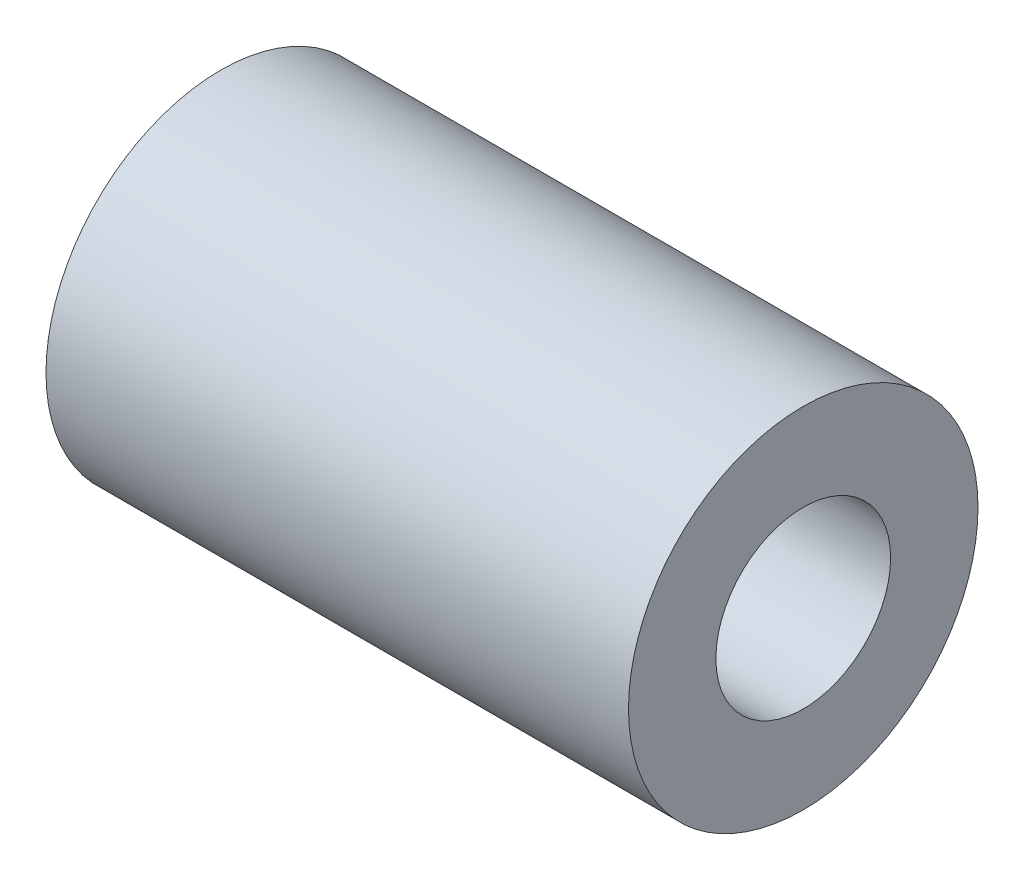
ISO-10303-21;
HEADER;
FILE_DESCRIPTION(('STEP AP214'),'2;1');
FILE_NAME('part.step','',(''),(''),'','','');
FILE_SCHEMA(('AUTOMOTIVE_DESIGN { 1 0 10303 214 1 1 1 1 }'));
ENDSEC;
DATA;
#1=APPLICATION_CONTEXT('core data for automotive mechanical design processes');
#2=APPLICATION_PROTOCOL_DEFINITION('international standard','automotive_design',2000,#1);
#3=PRODUCT_CONTEXT('',#1,'mechanical');
#4=PRODUCT('Part','Part','',(#3));
#5=PRODUCT_RELATED_PRODUCT_CATEGORY('part','',(#4));
#6=PRODUCT_DEFINITION_FORMATION('','',#4);
#7=PRODUCT_DEFINITION_CONTEXT('part definition',#1,'design');
#8=PRODUCT_DEFINITION('design','',#6,#7);
#9=PRODUCT_DEFINITION_SHAPE('','',#8);
#10=(LENGTH_UNIT() NAMED_UNIT(*) SI_UNIT(.MILLI.,.METRE.));
#11=(NAMED_UNIT(*) PLANE_ANGLE_UNIT() SI_UNIT($,.RADIAN.));
#12=(NAMED_UNIT(*) SI_UNIT($,.STERADIAN.) SOLID_ANGLE_UNIT());
#13=UNCERTAINTY_MEASURE_WITH_UNIT(LENGTH_MEASURE(1.E-05),#10,'distance_accuracy_value','');
#14=(GEOMETRIC_REPRESENTATION_CONTEXT(3) GLOBAL_UNCERTAINTY_ASSIGNED_CONTEXT((#13)) GLOBAL_UNIT_ASSIGNED_CONTEXT((#10,
#11,#12)) REPRESENTATION_CONTEXT('',''));
#15=CARTESIAN_POINT('',(0.,0.,0.));
#16=DIRECTION('',(0.,0.,1.));
#17=DIRECTION('',(1.,0.,0.));
#18=AXIS2_PLACEMENT_3D('',#15,#16,#17);
#19=CARTESIAN_POINT('',(10.,0.,0.));
#20=DIRECTION('',(1.,0.,0.));
#21=DIRECTION('',(0.,0.,-1.));
#22=AXIS2_PLACEMENT_3D('',#19,#20,#21);
#23=PLANE('',#22);
#24=CARTESIAN_POINT('',(10.,0.,0.));
#25=DIRECTION('',(1.,0.,0.));
#26=DIRECTION('',(0.,0.,-1.));
#27=AXIS2_PLACEMENT_3D('',#24,#25,#26);
#28=CIRCLE('',#27,3.);
#29=CARTESIAN_POINT('',(10.,0.,-3.));
#30=VERTEX_POINT('',#29);
#31=EDGE_CURVE('E10',#30,#30,#28,.T.);
#32=ORIENTED_EDGE('',*,*,#31,.T.);
#33=EDGE_LOOP('',(#32));
#34=FACE_BOUND('',#33,.T.);
#35=CARTESIAN_POINT('',(10.,0.,0.));
#36=DIRECTION('',(1.,0.,0.));
#37=DIRECTION('',(0.,0.,-1.));
#38=AXIS2_PLACEMENT_3D('',#35,#36,#37);
#39=CIRCLE('',#38,1.5);
#40=CARTESIAN_POINT('',(10.,0.,-1.5));
#41=VERTEX_POINT('',#40);
#42=EDGE_CURVE('E43',#41,#41,#39,.T.);
#43=ORIENTED_EDGE('',*,*,#42,.F.);
#44=EDGE_LOOP('',(#43));
#45=FACE_BOUND('',#44,.T.);
#46=ADVANCED_FACE('F32',(#34,#45),#23,.T.);
#47=CARTESIAN_POINT('',(0.,0.,0.));
#48=DIRECTION('',(1.,0.,0.));
#49=DIRECTION('',(0.,0.,-1.));
#50=AXIS2_PLACEMENT_3D('',#47,#48,#49);
#51=PLANE('',#50);
#52=CARTESIAN_POINT('',(0.,0.,0.));
#53=DIRECTION('',(1.,0.,0.));
#54=DIRECTION('',(0.,0.,-1.));
#55=AXIS2_PLACEMENT_3D('',#52,#53,#54);
#56=CIRCLE('',#55,3.);
#57=CARTESIAN_POINT('',(0.,0.,-3.));
#58=VERTEX_POINT('',#57);
#59=EDGE_CURVE('E36',#58,#58,#56,.T.);
#60=ORIENTED_EDGE('',*,*,#59,.F.);
#61=EDGE_LOOP('',(#60));
#62=FACE_BOUND('',#61,.T.);
#63=CARTESIAN_POINT('',(0.,0.,0.));
#64=DIRECTION('',(1.,0.,0.));
#65=DIRECTION('',(0.,0.,-1.));
#66=AXIS2_PLACEMENT_3D('',#63,#64,#65);
#67=CIRCLE('',#66,1.5);
#68=CARTESIAN_POINT('',(0.,0.,-1.5));
#69=VERTEX_POINT('',#68);
#70=EDGE_CURVE('E45',#69,#69,#67,.T.);
#71=ORIENTED_EDGE('',*,*,#70,.T.);
#72=EDGE_LOOP('',(#71));
#73=FACE_BOUND('',#72,.T.);
#74=ADVANCED_FACE('F55',(#62,#73),#51,.F.);
#75=CARTESIAN_POINT('',(10.,0.,0.));
#76=DIRECTION('',(-1.,0.,0.));
#77=DIRECTION('',(0.,0.,1.));
#78=AXIS2_PLACEMENT_3D('',#75,#76,#77);
#79=CYLINDRICAL_SURFACE('',#78,3.);
#80=ORIENTED_EDGE('',*,*,#31,.F.);
#81=EDGE_LOOP('',(#80));
#82=FACE_BOUND('',#81,.T.);
#83=ORIENTED_EDGE('',*,*,#59,.T.);
#84=EDGE_LOOP('',(#83));
#85=FACE_BOUND('',#84,.T.);
#86=ADVANCED_FACE('F34',(#82,#85),#79,.T.);
#87=CARTESIAN_POINT('',(10.,0.,0.));
#88=DIRECTION('',(-1.,0.,0.));
#89=DIRECTION('',(0.,0.,1.));
#90=AXIS2_PLACEMENT_3D('',#87,#88,#89);
#91=CYLINDRICAL_SURFACE('',#90,1.5);
#92=ORIENTED_EDGE('',*,*,#42,.T.);
#93=EDGE_LOOP('',(#92));
#94=FACE_BOUND('',#93,.T.);
#95=ORIENTED_EDGE('',*,*,#70,.F.);
#96=EDGE_LOOP('',(#95));
#97=FACE_BOUND('',#96,.T.);
#98=ADVANCED_FACE('F51',(#94,#97),#91,.F.);
#99=CLOSED_SHELL('',(#46,#74,#86,#98));
#100=MANIFOLD_SOLID_BREP('B2',#99);
#101=ADVANCED_BREP_SHAPE_REPRESENTATION('',(#18,#100),#14);
#102=SHAPE_DEFINITION_REPRESENTATION(#9,#101);
ENDSEC;
END-ISO-10303-21;
